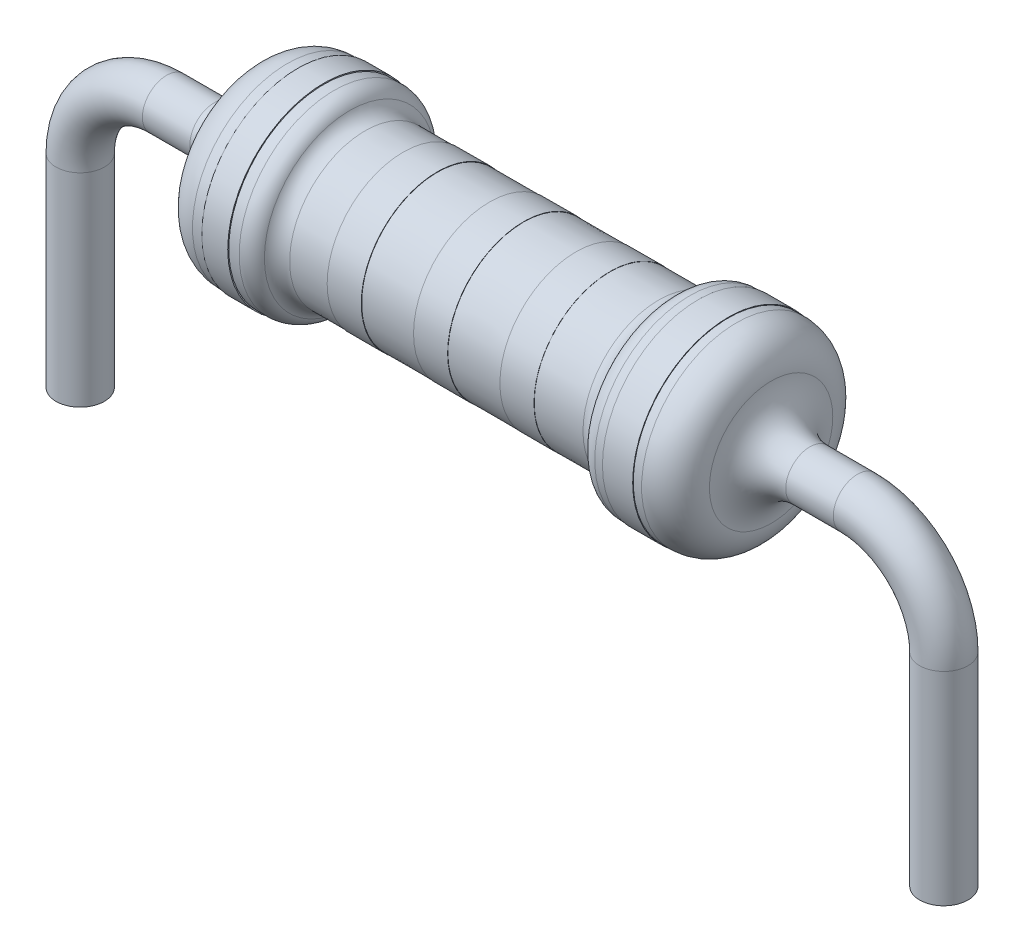
ISO-10303-21;
HEADER;
FILE_DESCRIPTION(('STEP AP214'),'2;1');
FILE_NAME('part.step','',(''),(''),'','','');
FILE_SCHEMA(('AUTOMOTIVE_DESIGN { 1 0 10303 214 1 1 1 1 }'));
ENDSEC;
DATA;
#1=APPLICATION_CONTEXT('core data for automotive mechanical design processes');
#2=APPLICATION_PROTOCOL_DEFINITION('international standard','automotive_design',2000,#1);
#3=PRODUCT_CONTEXT('',#1,'mechanical');
#4=PRODUCT('Part','Part','',(#3));
#5=PRODUCT_RELATED_PRODUCT_CATEGORY('part','',(#4));
#6=PRODUCT_DEFINITION_FORMATION('','',#4);
#7=PRODUCT_DEFINITION_CONTEXT('part definition',#1,'design');
#8=PRODUCT_DEFINITION('design','',#6,#7);
#9=PRODUCT_DEFINITION_SHAPE('','',#8);
#10=(LENGTH_UNIT() NAMED_UNIT(*) SI_UNIT(.MILLI.,.METRE.));
#11=(NAMED_UNIT(*) PLANE_ANGLE_UNIT() SI_UNIT($,.RADIAN.));
#12=(NAMED_UNIT(*) SI_UNIT($,.STERADIAN.) SOLID_ANGLE_UNIT());
#13=UNCERTAINTY_MEASURE_WITH_UNIT(LENGTH_MEASURE(1.E-05),#10,'distance_accuracy_value','');
#14=(GEOMETRIC_REPRESENTATION_CONTEXT(3) GLOBAL_UNCERTAINTY_ASSIGNED_CONTEXT((#13)) GLOBAL_UNIT_ASSIGNED_CONTEXT((#10,
#11,#12)) REPRESENTATION_CONTEXT('',''));
#15=CARTESIAN_POINT('',(0.,0.,0.));
#16=DIRECTION('',(0.,0.,1.));
#17=DIRECTION('',(1.,0.,0.));
#18=AXIS2_PLACEMENT_3D('',#15,#16,#17);
#19=CARTESIAN_POINT('',(-5.,1.84999999999999,0.));
#20=DIRECTION('',(0.,-1.,0.));
#21=DIRECTION('',(1.,0.,0.));
#22=AXIS2_PLACEMENT_3D('',#19,#20,#21);
#23=CYLINDRICAL_SURFACE('',#22,0.28);
#24=CARTESIAN_POINT('',(-5.,1.85,0.));
#25=DIRECTION('',(0.,1.,0.));
#26=DIRECTION('',(-1.,0.,0.));
#27=AXIS2_PLACEMENT_3D('',#24,#25,#26);
#28=CIRCLE('',#27,0.28);
#29=CARTESIAN_POINT('',(-5.28,1.85,0.));
#30=VERTEX_POINT('',#29);
#31=EDGE_CURVE('E202',#30,#30,#28,.T.);
#32=ORIENTED_EDGE('',*,*,#31,.F.);
#33=EDGE_LOOP('',(#32));
#34=FACE_BOUND('',#33,.T.);
#35=CARTESIAN_POINT('',(-5.,-0.499999999999722,0.));
#36=DIRECTION('',(0.,-1.,0.));
#37=DIRECTION('',(1.,0.,0.));
#38=AXIS2_PLACEMENT_3D('',#35,#36,#37);
#39=CIRCLE('',#38,0.28);
#40=CARTESIAN_POINT('',(-4.72,-0.49999999999973,0.));
#41=VERTEX_POINT('',#40);
#42=EDGE_CURVE('E56',#41,#41,#39,.F.);
#43=ORIENTED_EDGE('',*,*,#42,.T.);
#44=EDGE_LOOP('',(#43));
#45=FACE_BOUND('',#44,.T.);
#46=ADVANCED_FACE('F40',(#34,#45),#23,.T.);
#47=CARTESIAN_POINT('',(5.,1.85,0.));
#48=DIRECTION('',(0.,-1.,0.));
#49=DIRECTION('',(1.,0.,0.));
#50=AXIS2_PLACEMENT_3D('',#47,#48,#49);
#51=CYLINDRICAL_SURFACE('',#50,0.28);
#52=CARTESIAN_POINT('',(5.,1.85,0.));
#53=DIRECTION('',(0.,-1.,0.));
#54=DIRECTION('',(1.,0.,0.));
#55=AXIS2_PLACEMENT_3D('',#52,#53,#54);
#56=CIRCLE('',#55,0.28);
#57=CARTESIAN_POINT('',(5.28,1.85,0.));
#58=VERTEX_POINT('',#57);
#59=EDGE_CURVE('E10',#58,#58,#56,.T.);
#60=ORIENTED_EDGE('',*,*,#59,.T.);
#61=EDGE_LOOP('',(#60));
#62=FACE_BOUND('',#61,.T.);
#63=CARTESIAN_POINT('',(5.,-0.499999999999999,0.));
#64=DIRECTION('',(0.,-1.,0.));
#65=DIRECTION('',(1.,0.,0.));
#66=AXIS2_PLACEMENT_3D('',#63,#64,#65);
#67=CIRCLE('',#66,0.28);
#68=CARTESIAN_POINT('',(5.28,-0.500000000000007,0.));
#69=VERTEX_POINT('',#68);
#70=EDGE_CURVE('E43',#69,#69,#67,.F.);
#71=ORIENTED_EDGE('',*,*,#70,.T.);
#72=EDGE_LOOP('',(#71));
#73=FACE_BOUND('',#72,.T.);
#74=ADVANCED_FACE('F69',(#62,#73),#51,.T.);
#75=CARTESIAN_POINT('',(-4.,1.85,0.));
#76=DIRECTION('',(0.,0.,-1.));
#77=DIRECTION('',(-1.,0.,0.));
#78=AXIS2_PLACEMENT_3D('',#75,#76,#77);
#79=TOROIDAL_SURFACE('',#78,1.,0.28);
#80=CARTESIAN_POINT('',(-4.,2.85,0.));
#81=DIRECTION('',(1.,0.,0.));
#82=DIRECTION('',(0.,0.,-1.));
#83=AXIS2_PLACEMENT_3D('',#80,#81,#82);
#84=CIRCLE('',#83,0.28);
#85=CARTESIAN_POINT('',(-4.,2.85,-0.28));
#86=VERTEX_POINT('',#85);
#87=EDGE_CURVE('E197',#86,#86,#84,.T.);
#88=ORIENTED_EDGE('',*,*,#87,.F.);
#89=EDGE_LOOP('',(#88));
#90=FACE_BOUND('',#89,.T.);
#91=ORIENTED_EDGE('',*,*,#31,.T.);
#92=EDGE_LOOP('',(#91));
#93=FACE_BOUND('',#92,.T.);
#94=ADVANCED_FACE('F208',(#90,#93),#79,.T.);
#95=CARTESIAN_POINT('',(-3.99999999999999,2.85,0.));
#96=DIRECTION('',(1.,0.,0.));
#97=DIRECTION('',(0.,0.,-1.));
#98=AXIS2_PLACEMENT_3D('',#95,#96,#97);
#99=CYLINDRICAL_SURFACE('',#98,0.28);
#100=ORIENTED_EDGE('',*,*,#87,.T.);
#101=EDGE_LOOP('',(#100));
#102=FACE_BOUND('',#101,.T.);
#103=CARTESIAN_POINT('',(-3.44947042326381,2.85,0.));
#104=DIRECTION('',(1.,0.,0.));
#105=DIRECTION('',(0.,0.,-1.));
#106=AXIS2_PLACEMENT_3D('',#103,#104,#105);
#107=CIRCLE('',#106,0.28);
#108=CARTESIAN_POINT('',(-3.44947042326381,2.85,-0.28));
#109=VERTEX_POINT('',#108);
#110=EDGE_CURVE('E194',#109,#109,#107,.F.);
#111=ORIENTED_EDGE('',*,*,#110,.T.);
#112=EDGE_LOOP('',(#111));
#113=FACE_BOUND('',#112,.T.);
#114=ADVANCED_FACE('F189',(#102,#113),#99,.T.);
#115=CARTESIAN_POINT('',(-3.44947042326381,2.85,0.));
#116=DIRECTION('',(1.,0.,0.));
#117=DIRECTION('',(0.,0.,-1.));
#118=AXIS2_PLACEMENT_3D('',#115,#116,#117);
#119=TOROIDAL_SURFACE('',#118,0.73,0.45);
#120=CARTESIAN_POINT('',(-2.99975078741826,2.85,0.));
#121=DIRECTION('',(1.,0.,0.));
#122=DIRECTION('',(0.,0.,-1.));
#123=AXIS2_PLACEMENT_3D('',#120,#121,#122);
#124=CIRCLE('',#123,0.714117647058824);
#125=CARTESIAN_POINT('',(-2.99975078741826,2.85,-0.714117647058824));
#126=VERTEX_POINT('',#125);
#127=EDGE_CURVE('E171',#126,#126,#124,.T.);
#128=ORIENTED_EDGE('',*,*,#127,.F.);
#129=EDGE_LOOP('',(#128));
#130=FACE_BOUND('',#129,.T.);
#131=ORIENTED_EDGE('',*,*,#110,.F.);
#132=EDGE_LOOP('',(#131));
#133=FACE_BOUND('',#132,.T.);
#134=ADVANCED_FACE('F183',(#130,#133),#119,.F.);
#135=CARTESIAN_POINT('',(-2.6,2.85,0.));
#136=DIRECTION('',(1.,0.,0.));
#137=DIRECTION('',(0.,0.,-1.));
#138=AXIS2_PLACEMENT_3D('',#135,#136,#137);
#139=TOROIDAL_SURFACE('',#138,0.7,0.4);
#140=CARTESIAN_POINT('',(-2.6,2.85,0.));
#141=DIRECTION('',(1.,0.,0.));
#142=DIRECTION('',(0.,0.,-1.));
#143=AXIS2_PLACEMENT_3D('',#140,#141,#142);
#144=CIRCLE('',#143,1.1);
#145=CARTESIAN_POINT('',(-2.6,2.85,-1.1));
#146=VERTEX_POINT('',#145);
#147=EDGE_CURVE('E167',#146,#146,#144,.T.);
#148=ORIENTED_EDGE('',*,*,#147,.F.);
#149=EDGE_LOOP('',(#148));
#150=FACE_BOUND('',#149,.T.);
#151=ORIENTED_EDGE('',*,*,#127,.T.);
#152=EDGE_LOOP('',(#151));
#153=FACE_BOUND('',#152,.T.);
#154=ADVANCED_FACE('F178',(#150,#153),#139,.T.);
#155=CARTESIAN_POINT('',(-3.,2.85,0.));
#156=DIRECTION('',(1.,0.,0.));
#157=DIRECTION('',(0.,0.,-1.));
#158=AXIS2_PLACEMENT_3D('',#155,#156,#157);
#159=CYLINDRICAL_SURFACE('',#158,1.1);
#160=CARTESIAN_POINT('',(-2.47975570255855,2.85,0.));
#161=DIRECTION('',(1.,0.,0.));
#162=DIRECTION('',(0.,0.,-1.));
#163=AXIS2_PLACEMENT_3D('',#160,#161,#162);
#164=CIRCLE('',#163,1.1);
#165=CARTESIAN_POINT('',(-2.47975570255855,2.85,-1.1));
#166=VERTEX_POINT('',#165);
#167=EDGE_CURVE('E170',#166,#166,#164,.F.);
#168=ORIENTED_EDGE('',*,*,#167,.T.);
#169=EDGE_LOOP('',(#168));
#170=FACE_BOUND('',#169,.T.);
#171=ORIENTED_EDGE('',*,*,#147,.T.);
#172=EDGE_LOOP('',(#171));
#173=FACE_BOUND('',#172,.T.);
#174=ADVANCED_FACE('F182',(#170,#173),#159,.T.);
#175=CARTESIAN_POINT('',(-2.47975570255855,1.73810018173955,0.));
#176=DIRECTION('',(1.,0.,0.));
#177=DIRECTION('',(0.,0.,-1.));
#178=AXIS2_PLACEMENT_3D('',#175,#176,#177);
#179=PLANE('',#178);
#180=CARTESIAN_POINT('',(-2.47975570255855,2.85,0.));
#181=DIRECTION('',(-1.,0.,0.));
#182=DIRECTION('',(0.,0.,1.));
#183=AXIS2_PLACEMENT_3D('',#180,#181,#182);
#184=CIRCLE('',#183,1.11189981826045);
#185=CARTESIAN_POINT('',(-2.47975570255855,2.85,1.11189981826045));
#186=VERTEX_POINT('',#185);
#187=EDGE_CURVE('E592',#186,#186,#184,.F.);
#188=ORIENTED_EDGE('',*,*,#187,.F.);
#189=EDGE_LOOP('',(#188));
#190=FACE_BOUND('',#189,.T.);
#191=ORIENTED_EDGE('',*,*,#167,.F.);
#192=EDGE_LOOP('',(#191));
#193=FACE_BOUND('',#192,.T.);
#194=ADVANCED_FACE('F459',(#190,#193),#179,.F.);
#195=CARTESIAN_POINT('',(-2.99975078741841,2.85,0.));
#196=DIRECTION('',(-1.,0.,0.));
#197=DIRECTION('',(0.,0.,1.));
#198=AXIS2_PLACEMENT_3D('',#195,#196,#197);
#199=CYLINDRICAL_SURFACE('',#198,1.11189981826045);
#200=CARTESIAN_POINT('',(-2.1798426199037,2.85,0.));
#201=DIRECTION('',(-1.,0.,0.));
#202=DIRECTION('',(0.,0.,1.));
#203=AXIS2_PLACEMENT_3D('',#200,#201,#202);
#204=CIRCLE('',#203,1.11189981826045);
#205=CARTESIAN_POINT('',(-2.1798426199037,2.85,1.11189981826045));
#206=VERTEX_POINT('',#205);
#207=EDGE_CURVE('E595',#206,#206,#204,.T.);
#208=ORIENTED_EDGE('',*,*,#207,.T.);
#209=EDGE_LOOP('',(#208));
#210=FACE_BOUND('',#209,.T.);
#211=ORIENTED_EDGE('',*,*,#187,.T.);
#212=EDGE_LOOP('',(#211));
#213=FACE_BOUND('',#212,.T.);
#214=ADVANCED_FACE('F452',(#210,#213),#199,.T.);
#215=CARTESIAN_POINT('',(-2.1798426199037,1.73810018173955,0.));
#216=DIRECTION('',(-1.,0.,0.));
#217=DIRECTION('',(0.,0.,1.));
#218=AXIS2_PLACEMENT_3D('',#215,#216,#217);
#219=PLANE('',#218);
#220=CARTESIAN_POINT('',(-2.1798426199037,2.85,0.));
#221=DIRECTION('',(1.,0.,0.));
#222=DIRECTION('',(0.,0.,-1.));
#223=AXIS2_PLACEMENT_3D('',#220,#221,#222);
#224=CIRCLE('',#223,1.1);
#225=CARTESIAN_POINT('',(-2.1798426199037,2.85,-1.1));
#226=VERTEX_POINT('',#225);
#227=EDGE_CURVE('E164',#226,#226,#224,.T.);
#228=ORIENTED_EDGE('',*,*,#227,.F.);
#229=EDGE_LOOP('',(#228));
#230=FACE_BOUND('',#229,.T.);
#231=ORIENTED_EDGE('',*,*,#207,.F.);
#232=EDGE_LOOP('',(#231));
#233=FACE_BOUND('',#232,.T.);
#234=ADVANCED_FACE('F444',(#230,#233),#219,.F.);
#235=CARTESIAN_POINT('',(-3.,2.85,0.));
#236=DIRECTION('',(1.,0.,0.));
#237=DIRECTION('',(0.,0.,-1.));
#238=AXIS2_PLACEMENT_3D('',#235,#236,#237);
#239=CYLINDRICAL_SURFACE('',#238,1.1);
#240=ORIENTED_EDGE('',*,*,#227,.T.);
#241=EDGE_LOOP('',(#240));
#242=FACE_BOUND('',#241,.T.);
#243=CARTESIAN_POINT('',(-2.05959832246225,2.85,0.));
#244=DIRECTION('',(1.,0.,0.));
#245=DIRECTION('',(0.,0.,-1.));
#246=AXIS2_PLACEMENT_3D('',#243,#244,#245);
#247=CIRCLE('',#246,1.1);
#248=CARTESIAN_POINT('',(-2.05959832246225,2.85,-1.1));
#249=VERTEX_POINT('',#248);
#250=EDGE_CURVE('E161',#249,#249,#247,.T.);
#251=ORIENTED_EDGE('',*,*,#250,.F.);
#252=EDGE_LOOP('',(#251));
#253=FACE_BOUND('',#252,.T.);
#254=ADVANCED_FACE('F155',(#242,#253),#239,.T.);
#255=CARTESIAN_POINT('',(-2.05959832246225,2.85,0.));
#256=DIRECTION('',(1.,0.,0.));
#257=DIRECTION('',(0.,0.,-1.));
#258=AXIS2_PLACEMENT_3D('',#255,#256,#257);
#259=TOROIDAL_SURFACE('',#258,0.9,0.2);
#260=ORIENTED_EDGE('',*,*,#250,.T.);
#261=EDGE_LOOP('',(#260));
#262=FACE_BOUND('',#261,.T.);
#263=CARTESIAN_POINT('',(-1.87979916123112,2.85,0.));
#264=DIRECTION('',(-1.,0.,0.));
#265=DIRECTION('',(0.,0.,1.));
#266=AXIS2_PLACEMENT_3D('',#263,#264,#265);
#267=CIRCLE('',#266,0.987591447188547);
#268=CARTESIAN_POINT('',(-1.87979916123112,2.85,0.987591447188547));
#269=VERTEX_POINT('',#268);
#270=EDGE_CURVE('E137',#269,#269,#267,.T.);
#271=ORIENTED_EDGE('',*,*,#270,.T.);
#272=EDGE_LOOP('',(#271));
#273=FACE_BOUND('',#272,.T.);
#274=ADVANCED_FACE('F149',(#262,#273),#259,.T.);
#275=CARTESIAN_POINT('',(-1.7,2.85,0.));
#276=DIRECTION('',(-1.,0.,0.));
#277=DIRECTION('',(0.,0.,1.));
#278=AXIS2_PLACEMENT_3D('',#275,#276,#277);
#279=TOROIDAL_SURFACE('',#278,1.07518289437709,0.2);
#280=CARTESIAN_POINT('',(-1.6997956821001,2.85,0.));
#281=DIRECTION('',(1.,0.,0.));
#282=DIRECTION('',(0.,0.,-1.));
#283=AXIS2_PLACEMENT_3D('',#280,#281,#282);
#284=CIRCLE('',#283,0.875182998741675);
#285=CARTESIAN_POINT('',(-1.6997956821001,2.85,-0.875182998741675));
#286=VERTEX_POINT('',#285);
#287=EDGE_CURVE('E133',#286,#286,#284,.T.);
#288=ORIENTED_EDGE('',*,*,#287,.F.);
#289=EDGE_LOOP('',(#288));
#290=FACE_BOUND('',#289,.T.);
#291=ORIENTED_EDGE('',*,*,#270,.F.);
#292=EDGE_LOOP('',(#291));
#293=FACE_BOUND('',#292,.T.);
#294=ADVANCED_FACE('F144',(#290,#293),#279,.F.);
#295=CARTESIAN_POINT('',(-1.25968426573309,2.85,0.));
#296=DIRECTION('',(1.,0.,0.));
#297=DIRECTION('',(0.,0.,-1.));
#298=AXIS2_PLACEMENT_3D('',#295,#296,#297);
#299=CONICAL_SURFACE('',#298,0.875632612127863,0.00102158956345577);
#300=CARTESIAN_POINT('',(-1.25968252569592,2.85,0.));
#301=DIRECTION('',(1.,0.,0.));
#302=DIRECTION('',(0.,0.,-1.));
#303=AXIS2_PLACEMENT_3D('',#300,#301,#302);
#304=CIRCLE('',#303,0.875632613905468);
#305=CARTESIAN_POINT('',(-1.25968252569592,2.85,-0.875632613905468));
#306=VERTEX_POINT('',#305);
#307=EDGE_CURVE('E136',#306,#306,#304,.F.);
#308=ORIENTED_EDGE('',*,*,#307,.T.);
#309=EDGE_LOOP('',(#308));
#310=FACE_BOUND('',#309,.T.);
#311=ORIENTED_EDGE('',*,*,#287,.T.);
#312=EDGE_LOOP('',(#311));
#313=FACE_BOUND('',#312,.T.);
#314=ADVANCED_FACE('F148',(#310,#313),#299,.T.);
#315=CARTESIAN_POINT('',(-1.25968252569592,1.97436738787212,0.));
#316=DIRECTION('',(1.,0.,0.));
#317=DIRECTION('',(0.,0.,-1.));
#318=AXIS2_PLACEMENT_3D('',#315,#316,#317);
#319=PLANE('',#318);
#320=CARTESIAN_POINT('',(-1.25968252569592,2.85,0.));
#321=DIRECTION('',(1.,0.,0.));
#322=DIRECTION('',(0.,0.,-1.));
#323=AXIS2_PLACEMENT_3D('',#320,#321,#322);
#324=CIRCLE('',#323,0.880632612127881);
#325=CARTESIAN_POINT('',(-1.25968252569592,2.85,-0.880632612127881));
#326=VERTEX_POINT('',#325);
#327=EDGE_CURVE('E611',#326,#326,#324,.T.);
#328=ORIENTED_EDGE('',*,*,#327,.F.);
#329=EDGE_LOOP('',(#328));
#330=FACE_BOUND('',#329,.T.);
#331=ORIENTED_EDGE('',*,*,#307,.F.);
#332=EDGE_LOOP('',(#331));
#333=FACE_BOUND('',#332,.T.);
#334=ADVANCED_FACE('F412',(#330,#333),#319,.F.);
#335=CARTESIAN_POINT('',(-2.05959832246225,2.85,0.));
#336=DIRECTION('',(-1.,0.,0.));
#337=DIRECTION('',(0.,0.,1.));
#338=AXIS2_PLACEMENT_3D('',#335,#336,#337);
#339=CYLINDRICAL_SURFACE('',#338,0.880632612127881);
#340=CARTESIAN_POINT('',(-0.86510460484195,2.85,0.));
#341=DIRECTION('',(-1.,0.,0.));
#342=DIRECTION('',(0.,0.,1.));
#343=AXIS2_PLACEMENT_3D('',#340,#341,#342);
#344=CIRCLE('',#343,0.880632612127881);
#345=CARTESIAN_POINT('',(-0.86510460484195,2.85,0.880632612127881));
#346=VERTEX_POINT('',#345);
#347=EDGE_CURVE('E614',#346,#346,#344,.T.);
#348=ORIENTED_EDGE('',*,*,#347,.T.);
#349=EDGE_LOOP('',(#348));
#350=FACE_BOUND('',#349,.T.);
#351=ORIENTED_EDGE('',*,*,#327,.T.);
#352=EDGE_LOOP('',(#351));
#353=FACE_BOUND('',#352,.T.);
#354=ADVANCED_FACE('F404',(#350,#353),#339,.T.);
#355=CARTESIAN_POINT('',(-0.86510460484195,1.96936738787212,0.));
#356=DIRECTION('',(-1.,0.,0.));
#357=DIRECTION('',(0.,0.,1.));
#358=AXIS2_PLACEMENT_3D('',#355,#356,#357);
#359=PLANE('',#358);
#360=CARTESIAN_POINT('',(-0.865104604827138,2.85,0.));
#361=DIRECTION('',(1.,0.,0.));
#362=DIRECTION('',(0.,0.,-1.));
#363=AXIS2_PLACEMENT_3D('',#360,#361,#362);
#364=CIRCLE('',#363,0.876035710731751);
#365=CARTESIAN_POINT('',(-0.865104604827138,2.85,-0.876035710731751));
#366=VERTEX_POINT('',#365);
#367=EDGE_CURVE('E619',#366,#366,#364,.T.);
#368=ORIENTED_EDGE('',*,*,#367,.F.);
#369=EDGE_LOOP('',(#368));
#370=FACE_BOUND('',#369,.T.);
#371=ORIENTED_EDGE('',*,*,#347,.F.);
#372=EDGE_LOOP('',(#371));
#373=FACE_BOUND('',#372,.T.);
#374=ADVANCED_FACE('F395',(#370,#373),#359,.F.);
#375=CARTESIAN_POINT('',(-0.259682525779681,2.85,0.));
#376=DIRECTION('',(1.,0.,0.));
#377=DIRECTION('',(0.,0.,-1.));
#378=AXIS2_PLACEMENT_3D('',#375,#376,#377);
#379=CONICAL_SURFACE('',#378,0.876654203824434,0.00102158956358786);
#380=CARTESIAN_POINT('',(-0.259682525722837,2.85,0.));
#381=DIRECTION('',(1.,0.,0.));
#382=DIRECTION('',(0.,0.,-1.));
#383=AXIS2_PLACEMENT_3D('',#380,#381,#382);
#384=CIRCLE('',#383,0.876654203824492);
#385=CARTESIAN_POINT('',(-0.259682525722837,2.85,-0.876654203824492));
#386=VERTEX_POINT('',#385);
#387=EDGE_CURVE('E624',#386,#386,#384,.F.);
#388=ORIENTED_EDGE('',*,*,#387,.T.);
#389=EDGE_LOOP('',(#388));
#390=FACE_BOUND('',#389,.T.);
#391=ORIENTED_EDGE('',*,*,#367,.T.);
#392=EDGE_LOOP('',(#391));
#393=FACE_BOUND('',#392,.T.);
#394=ADVANCED_FACE('F387',(#390,#393),#379,.T.);
#395=CARTESIAN_POINT('',(-0.259682525695923,1.97436738787212,0.));
#396=DIRECTION('',(1.,0.,0.));
#397=DIRECTION('',(0.,0.,-1.));
#398=AXIS2_PLACEMENT_3D('',#395,#396,#397);
#399=PLANE('',#398);
#400=CARTESIAN_POINT('',(-0.259682525695923,2.85,0.));
#401=DIRECTION('',(1.,0.,0.));
#402=DIRECTION('',(0.,0.,-1.));
#403=AXIS2_PLACEMENT_3D('',#400,#401,#402);
#404=CIRCLE('',#403,0.880632612127881);
#405=CARTESIAN_POINT('',(-0.259682525695923,2.85,-0.880632612127881));
#406=VERTEX_POINT('',#405);
#407=EDGE_CURVE('E629',#406,#406,#404,.T.);
#408=ORIENTED_EDGE('',*,*,#407,.F.);
#409=EDGE_LOOP('',(#408));
#410=FACE_BOUND('',#409,.T.);
#411=ORIENTED_EDGE('',*,*,#387,.F.);
#412=EDGE_LOOP('',(#411));
#413=FACE_BOUND('',#412,.T.);
#414=ADVANCED_FACE('F378',(#410,#413),#399,.F.);
#415=CARTESIAN_POINT('',(-2.05959832246225,2.85,0.));
#416=DIRECTION('',(-1.,0.,0.));
#417=DIRECTION('',(0.,0.,1.));
#418=AXIS2_PLACEMENT_3D('',#415,#416,#417);
#419=CYLINDRICAL_SURFACE('',#418,0.880632612127881);
#420=CARTESIAN_POINT('',(0.13489539515805,2.85,0.));
#421=DIRECTION('',(-1.,0.,0.));
#422=DIRECTION('',(0.,0.,1.));
#423=AXIS2_PLACEMENT_3D('',#420,#421,#422);
#424=CIRCLE('',#423,0.880632612127881);
#425=CARTESIAN_POINT('',(0.13489539515805,2.85,0.880632612127881));
#426=VERTEX_POINT('',#425);
#427=EDGE_CURVE('E632',#426,#426,#424,.T.);
#428=ORIENTED_EDGE('',*,*,#427,.T.);
#429=EDGE_LOOP('',(#428));
#430=FACE_BOUND('',#429,.T.);
#431=ORIENTED_EDGE('',*,*,#407,.T.);
#432=EDGE_LOOP('',(#431));
#433=FACE_BOUND('',#432,.T.);
#434=ADVANCED_FACE('F370',(#430,#433),#419,.T.);
#435=CARTESIAN_POINT('',(0.13489539515805,1.96936738787212,0.));
#436=DIRECTION('',(-1.,0.,0.));
#437=DIRECTION('',(0.,0.,1.));
#438=AXIS2_PLACEMENT_3D('',#435,#436,#437);
#439=PLANE('',#438);
#440=ORIENTED_EDGE('',*,*,#427,.F.);
#441=EDGE_LOOP('',(#440));
#442=FACE_BOUND('',#441,.T.);
#443=CARTESIAN_POINT('',(0.134895395149215,2.85,0.));
#444=DIRECTION('',(1.,0.,0.));
#445=DIRECTION('',(0.,1.,0.));
#446=AXIS2_PLACEMENT_3D('',#443,#444,#445);
#447=CIRCLE('',#446,0.877057300650743);
#448=CARTESIAN_POINT('',(0.134895395149215,3.72705730065074,0.));
#449=VERTEX_POINT('',#448);
#450=EDGE_CURVE('E637',#449,#449,#447,.T.);
#451=ORIENTED_EDGE('',*,*,#450,.F.);
#452=EDGE_LOOP('',(#451));
#453=FACE_BOUND('',#452,.T.);
#454=ADVANCED_FACE('F361',(#442,#453),#439,.F.);
#455=CARTESIAN_POINT('',(0.740317474253516,2.85,0.));
#456=DIRECTION('',(1.,0.,0.));
#457=DIRECTION('',(0.,1.,0.));
#458=AXIS2_PLACEMENT_3D('',#455,#456,#457);
#459=CONICAL_SURFACE('',#458,0.877675793743427,0.00102158956349194);
#460=CARTESIAN_POINT('',(0.740317474310359,2.85,0.));
#461=DIRECTION('',(1.,0.,0.));
#462=DIRECTION('',(0.,1.,0.));
#463=AXIS2_PLACEMENT_3D('',#460,#461,#462);
#464=CIRCLE('',#463,0.877675793743485);
#465=CARTESIAN_POINT('',(0.740317474310359,3.72767579374349,0.));
#466=VERTEX_POINT('',#465);
#467=EDGE_CURVE('E642',#466,#466,#464,.F.);
#468=ORIENTED_EDGE('',*,*,#467,.T.);
#469=EDGE_LOOP('',(#468));
#470=FACE_BOUND('',#469,.T.);
#471=ORIENTED_EDGE('',*,*,#450,.T.);
#472=EDGE_LOOP('',(#471));
#473=FACE_BOUND('',#472,.T.);
#474=ADVANCED_FACE('F353',(#470,#473),#459,.T.);
#475=CARTESIAN_POINT('',(0.740317474304077,1.97436738787212,0.));
#476=DIRECTION('',(1.,0.,0.));
#477=DIRECTION('',(0.,0.,-1.));
#478=AXIS2_PLACEMENT_3D('',#475,#476,#477);
#479=PLANE('',#478);
#480=CARTESIAN_POINT('',(0.740317474304077,2.85,0.));
#481=DIRECTION('',(1.,0.,0.));
#482=DIRECTION('',(0.,0.,-1.));
#483=AXIS2_PLACEMENT_3D('',#480,#481,#482);
#484=CIRCLE('',#483,0.880632612127881);
#485=CARTESIAN_POINT('',(0.740317474304077,2.85,-0.880632612127881));
#486=VERTEX_POINT('',#485);
#487=EDGE_CURVE('E647',#486,#486,#484,.T.);
#488=ORIENTED_EDGE('',*,*,#487,.F.);
#489=EDGE_LOOP('',(#488));
#490=FACE_BOUND('',#489,.T.);
#491=ORIENTED_EDGE('',*,*,#467,.F.);
#492=EDGE_LOOP('',(#491));
#493=FACE_BOUND('',#492,.T.);
#494=ADVANCED_FACE('F344',(#490,#493),#479,.F.);
#495=CARTESIAN_POINT('',(-2.05959832246225,2.85,0.));
#496=DIRECTION('',(-1.,0.,0.));
#497=DIRECTION('',(0.,0.,1.));
#498=AXIS2_PLACEMENT_3D('',#495,#496,#497);
#499=CYLINDRICAL_SURFACE('',#498,0.880632612127881);
#500=CARTESIAN_POINT('',(1.13489539515805,2.85,0.));
#501=DIRECTION('',(-1.,0.,0.));
#502=DIRECTION('',(0.,0.,1.));
#503=AXIS2_PLACEMENT_3D('',#500,#501,#502);
#504=CIRCLE('',#503,0.880632612127881);
#505=CARTESIAN_POINT('',(1.13489539515805,2.85,0.880632612127881));
#506=VERTEX_POINT('',#505);
#507=EDGE_CURVE('E650',#506,#506,#504,.T.);
#508=ORIENTED_EDGE('',*,*,#507,.T.);
#509=EDGE_LOOP('',(#508));
#510=FACE_BOUND('',#509,.T.);
#511=ORIENTED_EDGE('',*,*,#487,.T.);
#512=EDGE_LOOP('',(#511));
#513=FACE_BOUND('',#512,.T.);
#514=ADVANCED_FACE('F337',(#510,#513),#499,.T.);
#515=CARTESIAN_POINT('',(1.13489539515805,1.96936738787212,0.));
#516=DIRECTION('',(-1.,0.,0.));
#517=DIRECTION('',(0.,0.,1.));
#518=AXIS2_PLACEMENT_3D('',#515,#516,#517);
#519=PLANE('',#518);
#520=ORIENTED_EDGE('',*,*,#507,.F.);
#521=EDGE_LOOP('',(#520));
#522=FACE_BOUND('',#521,.T.);
#523=CARTESIAN_POINT('',(1.13489539518241,2.85,0.));
#524=DIRECTION('',(1.,0.,0.));
#525=DIRECTION('',(0.,0.,-1.));
#526=AXIS2_PLACEMENT_3D('',#523,#524,#525);
#527=CIRCLE('',#526,0.878078890569736);
#528=CARTESIAN_POINT('',(1.13489539518241,2.85,-0.878078890569736));
#529=VERTEX_POINT('',#528);
#530=EDGE_CURVE('E130',#529,#529,#527,.T.);
#531=ORIENTED_EDGE('',*,*,#530,.F.);
#532=EDGE_LOOP('',(#531));
#533=FACE_BOUND('',#532,.T.);
#534=ADVANCED_FACE('F329',(#522,#533),#519,.F.);
#535=CARTESIAN_POINT('',(1.70020431784224,2.85,0.));
#536=DIRECTION('',(1.,0.,0.));
#537=DIRECTION('',(0.,0.,-1.));
#538=AXIS2_PLACEMENT_3D('',#535,#536,#537);
#539=CONICAL_SURFACE('',#538,0.878656404466271,0.00102158956365252);
#540=ORIENTED_EDGE('',*,*,#530,.T.);
#541=EDGE_LOOP('',(#540));
#542=FACE_BOUND('',#541,.T.);
#543=CARTESIAN_POINT('',(1.70020431787719,2.85,0.));
#544=DIRECTION('',(-1.,0.,0.));
#545=DIRECTION('',(0.,0.,1.));
#546=AXIS2_PLACEMENT_3D('',#543,#544,#545);
#547=CIRCLE('',#546,0.878656404466264);
#548=CARTESIAN_POINT('',(1.70020431787719,2.85,0.878656404466264));
#549=VERTEX_POINT('',#548);
#550=EDGE_CURVE('E127',#549,#549,#547,.T.);
#551=ORIENTED_EDGE('',*,*,#550,.T.);
#552=EDGE_LOOP('',(#551));
#553=FACE_BOUND('',#552,.T.);
#554=ADVANCED_FACE('F121',(#542,#553),#539,.T.);
#555=CARTESIAN_POINT('',(1.7,2.85,0.));
#556=DIRECTION('',(-1.,0.,0.));
#557=DIRECTION('',(0.,0.,1.));
#558=AXIS2_PLACEMENT_3D('',#555,#556,#557);
#559=TOROIDAL_SURFACE('',#558,1.07865630010175,0.2);
#560=ORIENTED_EDGE('',*,*,#550,.F.);
#561=EDGE_LOOP('',(#560));
#562=FACE_BOUND('',#561,.T.);
#563=CARTESIAN_POINT('',(1.87894267687863,2.85,0.));
#564=DIRECTION('',(1.,0.,0.));
#565=DIRECTION('',(0.,0.,-1.));
#566=AXIS2_PLACEMENT_3D('',#563,#564,#565);
#567=CIRCLE('',#566,0.989328150050875);
#568=CARTESIAN_POINT('',(1.87894267687863,2.85,-0.989328150050875));
#569=VERTEX_POINT('',#568);
#570=EDGE_CURVE('E103',#569,#569,#567,.T.);
#571=ORIENTED_EDGE('',*,*,#570,.F.);
#572=EDGE_LOOP('',(#571));
#573=FACE_BOUND('',#572,.T.);
#574=ADVANCED_FACE('F115',(#562,#573),#559,.F.);
#575=CARTESIAN_POINT('',(2.05788535375725,2.85,0.));
#576=DIRECTION('',(1.,0.,0.));
#577=DIRECTION('',(0.,0.,-1.));
#578=AXIS2_PLACEMENT_3D('',#575,#576,#577);
#579=TOROIDAL_SURFACE('',#578,0.9,0.2);
#580=ORIENTED_EDGE('',*,*,#570,.T.);
#581=EDGE_LOOP('',(#580));
#582=FACE_BOUND('',#581,.T.);
#583=CARTESIAN_POINT('',(2.05788535375725,2.85,0.));
#584=DIRECTION('',(1.,0.,0.));
#585=DIRECTION('',(0.,0.,-1.));
#586=AXIS2_PLACEMENT_3D('',#583,#584,#585);
#587=CIRCLE('',#586,1.1);
#588=CARTESIAN_POINT('',(2.05788535375725,2.85,-1.1));
#589=VERTEX_POINT('',#588);
#590=EDGE_CURVE('E99',#589,#589,#587,.T.);
#591=ORIENTED_EDGE('',*,*,#590,.F.);
#592=EDGE_LOOP('',(#591));
#593=FACE_BOUND('',#592,.T.);
#594=ADVANCED_FACE('F110',(#582,#593),#579,.T.);
#595=CARTESIAN_POINT('',(-3.,2.85,0.));
#596=DIRECTION('',(1.,0.,0.));
#597=DIRECTION('',(0.,0.,-1.));
#598=AXIS2_PLACEMENT_3D('',#595,#596,#597);
#599=CYLINDRICAL_SURFACE('',#598,1.1);
#600=CARTESIAN_POINT('',(2.15394267687863,2.85,0.));
#601=DIRECTION('',(1.,0.,0.));
#602=DIRECTION('',(0.,0.,-1.));
#603=AXIS2_PLACEMENT_3D('',#600,#601,#602);
#604=CIRCLE('',#603,1.1);
#605=CARTESIAN_POINT('',(2.15394267687863,2.85,-1.1));
#606=VERTEX_POINT('',#605);
#607=EDGE_CURVE('E102',#606,#606,#604,.F.);
#608=ORIENTED_EDGE('',*,*,#607,.T.);
#609=EDGE_LOOP('',(#608));
#610=FACE_BOUND('',#609,.T.);
#611=ORIENTED_EDGE('',*,*,#590,.T.);
#612=EDGE_LOOP('',(#611));
#613=FACE_BOUND('',#612,.T.);
#614=ADVANCED_FACE('F114',(#610,#613),#599,.T.);
#615=CARTESIAN_POINT('',(2.15394267687863,1.74291252390224,0.));
#616=DIRECTION('',(1.,0.,0.));
#617=DIRECTION('',(0.,0.,-1.));
#618=AXIS2_PLACEMENT_3D('',#615,#616,#617);
#619=PLANE('',#618);
#620=CARTESIAN_POINT('',(2.15394267687863,2.85,0.));
#621=DIRECTION('',(-1.,0.,0.));
#622=DIRECTION('',(0.,0.,1.));
#623=AXIS2_PLACEMENT_3D('',#620,#621,#622);
#624=CIRCLE('',#623,1.10708747609776);
#625=CARTESIAN_POINT('',(2.15394267687863,2.85,1.10708747609776));
#626=VERTEX_POINT('',#625);
#627=EDGE_CURVE('E663',#626,#626,#624,.F.);
#628=ORIENTED_EDGE('',*,*,#627,.F.);
#629=EDGE_LOOP('',(#628));
#630=FACE_BOUND('',#629,.T.);
#631=ORIENTED_EDGE('',*,*,#607,.F.);
#632=EDGE_LOOP('',(#631));
#633=FACE_BOUND('',#632,.T.);
#634=ADVANCED_FACE('F297',(#630,#633),#619,.F.);
#635=CARTESIAN_POINT('',(2.05788535375725,2.85,0.));
#636=DIRECTION('',(-1.,0.,0.));
#637=DIRECTION('',(0.,0.,1.));
#638=AXIS2_PLACEMENT_3D('',#635,#636,#637);
#639=CYLINDRICAL_SURFACE('',#638,1.10708747609776);
#640=CARTESIAN_POINT('',(2.50394267687863,2.85,0.));
#641=DIRECTION('',(-1.,0.,0.));
#642=DIRECTION('',(0.,0.,1.));
#643=AXIS2_PLACEMENT_3D('',#640,#641,#642);
#644=CIRCLE('',#643,1.10708747609776);
#645=CARTESIAN_POINT('',(2.50394267687863,2.85,1.10708747609776));
#646=VERTEX_POINT('',#645);
#647=EDGE_CURVE('E668',#646,#646,#644,.T.);
#648=ORIENTED_EDGE('',*,*,#647,.T.);
#649=EDGE_LOOP('',(#648));
#650=FACE_BOUND('',#649,.T.);
#651=ORIENTED_EDGE('',*,*,#627,.T.);
#652=EDGE_LOOP('',(#651));
#653=FACE_BOUND('',#652,.T.);
#654=ADVANCED_FACE('F289',(#650,#653),#639,.T.);
#655=CARTESIAN_POINT('',(2.50394267687863,1.74291252390224,0.));
#656=DIRECTION('',(-1.,0.,0.));
#657=DIRECTION('',(0.,0.,1.));
#658=AXIS2_PLACEMENT_3D('',#655,#656,#657);
#659=PLANE('',#658);
#660=ORIENTED_EDGE('',*,*,#647,.F.);
#661=EDGE_LOOP('',(#660));
#662=FACE_BOUND('',#661,.T.);
#663=CARTESIAN_POINT('',(2.50394267687863,2.85,0.));
#664=DIRECTION('',(1.,0.,0.));
#665=DIRECTION('',(0.,0.,-1.));
#666=AXIS2_PLACEMENT_3D('',#663,#664,#665);
#667=CIRCLE('',#666,1.1);
#668=CARTESIAN_POINT('',(2.50394267687863,2.85,-1.1));
#669=VERTEX_POINT('',#668);
#670=EDGE_CURVE('E96',#669,#669,#667,.T.);
#671=ORIENTED_EDGE('',*,*,#670,.F.);
#672=EDGE_LOOP('',(#671));
#673=FACE_BOUND('',#672,.T.);
#674=ADVANCED_FACE('F281',(#662,#673),#659,.F.);
#675=CARTESIAN_POINT('',(-3.,2.85,0.));
#676=DIRECTION('',(1.,0.,0.));
#677=DIRECTION('',(0.,0.,-1.));
#678=AXIS2_PLACEMENT_3D('',#675,#676,#677);
#679=CYLINDRICAL_SURFACE('',#678,1.1);
#680=ORIENTED_EDGE('',*,*,#670,.T.);
#681=EDGE_LOOP('',(#680));
#682=FACE_BOUND('',#681,.T.);
#683=CARTESIAN_POINT('',(2.6,2.85,0.));
#684=DIRECTION('',(1.,0.,0.));
#685=DIRECTION('',(0.,0.,-1.));
#686=AXIS2_PLACEMENT_3D('',#683,#684,#685);
#687=CIRCLE('',#686,1.1);
#688=CARTESIAN_POINT('',(2.6,2.85,-1.1));
#689=VERTEX_POINT('',#688);
#690=EDGE_CURVE('E90',#689,#689,#687,.T.);
#691=ORIENTED_EDGE('',*,*,#690,.F.);
#692=EDGE_LOOP('',(#691));
#693=FACE_BOUND('',#692,.T.);
#694=ADVANCED_FACE('F273',(#682,#693),#679,.T.);
#695=CARTESIAN_POINT('',(2.6,2.85,0.));
#696=DIRECTION('',(1.,0.,0.));
#697=DIRECTION('',(0.,0.,-1.));
#698=AXIS2_PLACEMENT_3D('',#695,#696,#697);
#699=TOROIDAL_SURFACE('',#698,0.7,0.4);
#700=ORIENTED_EDGE('',*,*,#690,.T.);
#701=EDGE_LOOP('',(#700));
#702=FACE_BOUND('',#701,.T.);
#703=CARTESIAN_POINT('',(2.99975078741827,2.85,0.));
#704=DIRECTION('',(1.,0.,0.));
#705=DIRECTION('',(0.,0.,-1.));
#706=AXIS2_PLACEMENT_3D('',#703,#704,#705);
#707=CIRCLE('',#706,0.714117647058824);
#708=CARTESIAN_POINT('',(2.99975078741827,2.85,-0.714117647058824));
#709=VERTEX_POINT('',#708);
#710=EDGE_CURVE('E87',#709,#709,#707,.F.);
#711=ORIENTED_EDGE('',*,*,#710,.T.);
#712=EDGE_LOOP('',(#711));
#713=FACE_BOUND('',#712,.T.);
#714=ADVANCED_FACE('F78',(#702,#713),#699,.T.);
#715=CARTESIAN_POINT('',(3.44947042326381,2.85,0.));
#716=DIRECTION('',(1.,0.,0.));
#717=DIRECTION('',(0.,0.,-1.));
#718=AXIS2_PLACEMENT_3D('',#715,#716,#717);
#719=TOROIDAL_SURFACE('',#718,0.73,0.45);
#720=CARTESIAN_POINT('',(3.44947042326381,2.85,0.));
#721=DIRECTION('',(1.,0.,0.));
#722=DIRECTION('',(0.,0.,-1.));
#723=AXIS2_PLACEMENT_3D('',#720,#721,#722);
#724=CIRCLE('',#723,0.28);
#725=CARTESIAN_POINT('',(3.44947042326381,2.85,-0.28));
#726=VERTEX_POINT('',#725);
#727=EDGE_CURVE('E52',#726,#726,#724,.T.);
#728=ORIENTED_EDGE('',*,*,#727,.F.);
#729=EDGE_LOOP('',(#728));
#730=FACE_BOUND('',#729,.T.);
#731=ORIENTED_EDGE('',*,*,#710,.F.);
#732=EDGE_LOOP('',(#731));
#733=FACE_BOUND('',#732,.T.);
#734=ADVANCED_FACE('F73',(#730,#733),#719,.F.);
#735=CARTESIAN_POINT('',(-3.99999999999999,2.85,0.));
#736=DIRECTION('',(1.,0.,0.));
#737=DIRECTION('',(0.,0.,-1.));
#738=AXIS2_PLACEMENT_3D('',#735,#736,#737);
#739=CYLINDRICAL_SURFACE('',#738,0.28);
#740=CARTESIAN_POINT('',(3.99999999999999,2.85,0.));
#741=DIRECTION('',(1.,0.,0.));
#742=DIRECTION('',(0.,1.,0.));
#743=AXIS2_PLACEMENT_3D('',#740,#741,#742);
#744=CIRCLE('',#743,0.28);
#745=CARTESIAN_POINT('',(3.99999999999998,3.13,0.));
#746=VERTEX_POINT('',#745);
#747=EDGE_CURVE('E47',#746,#746,#744,.T.);
#748=ORIENTED_EDGE('',*,*,#747,.F.);
#749=EDGE_LOOP('',(#748));
#750=FACE_BOUND('',#749,.T.);
#751=ORIENTED_EDGE('',*,*,#727,.T.);
#752=EDGE_LOOP('',(#751));
#753=FACE_BOUND('',#752,.T.);
#754=ADVANCED_FACE('F67',(#750,#753),#739,.T.);
#755=CARTESIAN_POINT('',(4.,1.85,0.));
#756=DIRECTION('',(0.,0.,-1.));
#757=DIRECTION('',(-1.,0.,0.));
#758=AXIS2_PLACEMENT_3D('',#755,#756,#757);
#759=TOROIDAL_SURFACE('',#758,1.,0.28);
#760=ORIENTED_EDGE('',*,*,#59,.F.);
#761=EDGE_LOOP('',(#760));
#762=FACE_BOUND('',#761,.T.);
#763=ORIENTED_EDGE('',*,*,#747,.T.);
#764=EDGE_LOOP('',(#763));
#765=FACE_BOUND('',#764,.T.);
#766=ADVANCED_FACE('F62',(#762,#765),#759,.T.);
#767=CARTESIAN_POINT('',(0.,-0.49999999999986,0.));
#768=DIRECTION('',(0.,-1.,0.));
#769=DIRECTION('',(1.,0.,0.));
#770=AXIS2_PLACEMENT_3D('',#767,#768,#769);
#771=PLANE('',#770);
#772=ORIENTED_EDGE('',*,*,#70,.F.);
#773=EDGE_LOOP('',(#772));
#774=FACE_BOUND('',#773,.T.);
#775=ADVANCED_FACE('F66',(#774),#771,.T.);
#776=ORIENTED_EDGE('',*,*,#42,.F.);
#777=EDGE_LOOP('',(#776));
#778=FACE_BOUND('',#777,.T.);
#779=ADVANCED_FACE('F220',(#778),#771,.T.);
#780=CLOSED_SHELL('',(#46,#74,#94,#114,#134,#154,#174,#194,#214,#234,#254,#274,#294,#314,#334,
#354,#374,#394,#414,#434,#454,#474,#494,#514,#534,#554,#574,#594,#614,#634,#654,#674,#694,#714,
#734,#754,#766,#775,#779));
#781=MANIFOLD_SOLID_BREP('B2',#780);
#782=ADVANCED_BREP_SHAPE_REPRESENTATION('',(#18,#781),#14);
#783=SHAPE_DEFINITION_REPRESENTATION(#9,#782);
ENDSEC;
END-ISO-10303-21;
